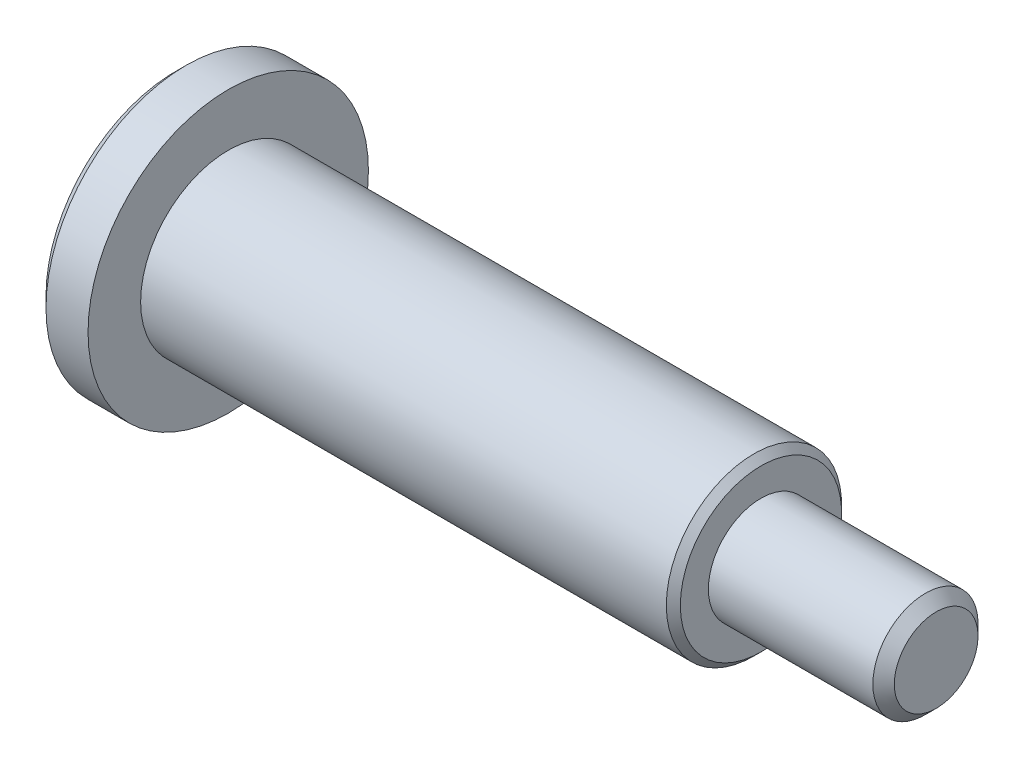
ISO-10303-21;
HEADER;
FILE_DESCRIPTION(('STEP AP214'),'2;1');
FILE_NAME('part.step','',(''),(''),'','','');
FILE_SCHEMA(('AUTOMOTIVE_DESIGN { 1 0 10303 214 1 1 1 1 }'));
ENDSEC;
DATA;
#1=APPLICATION_CONTEXT('core data for automotive mechanical design processes');
#2=APPLICATION_PROTOCOL_DEFINITION('international standard','automotive_design',2000,#1);
#3=PRODUCT_CONTEXT('',#1,'mechanical');
#4=PRODUCT('Part','Part','',(#3));
#5=PRODUCT_RELATED_PRODUCT_CATEGORY('part','',(#4));
#6=PRODUCT_DEFINITION_FORMATION('','',#4);
#7=PRODUCT_DEFINITION_CONTEXT('part definition',#1,'design');
#8=PRODUCT_DEFINITION('design','',#6,#7);
#9=PRODUCT_DEFINITION_SHAPE('','',#8);
#10=(LENGTH_UNIT() NAMED_UNIT(*) SI_UNIT(.MILLI.,.METRE.));
#11=(NAMED_UNIT(*) PLANE_ANGLE_UNIT() SI_UNIT($,.RADIAN.));
#12=(NAMED_UNIT(*) SI_UNIT($,.STERADIAN.) SOLID_ANGLE_UNIT());
#13=UNCERTAINTY_MEASURE_WITH_UNIT(LENGTH_MEASURE(1.E-05),#10,'distance_accuracy_value','');
#14=(GEOMETRIC_REPRESENTATION_CONTEXT(3) GLOBAL_UNCERTAINTY_ASSIGNED_CONTEXT((#13)) GLOBAL_UNIT_ASSIGNED_CONTEXT((#10,
#11,#12)) REPRESENTATION_CONTEXT('',''));
#15=CARTESIAN_POINT('',(0.,0.,0.));
#16=DIRECTION('',(0.,0.,1.));
#17=DIRECTION('',(1.,0.,0.));
#18=AXIS2_PLACEMENT_3D('',#15,#16,#17);
#19=CARTESIAN_POINT('',(0.,0.,0.));
#20=DIRECTION('',(-1.,0.,0.));
#21=DIRECTION('',(0.,0.,1.));
#22=AXIS2_PLACEMENT_3D('',#19,#20,#21);
#23=CONICAL_SURFACE('',#22,0.749999999982265,1.04719755120245);
#24=CARTESIAN_POINT('',(0.433012701876123,0.,0.));
#25=VERTEX_POINT('',#24);
#26=VERTEX_LOOP('',#25);
#27=FACE_BOUND('',#26,.T.);
#28=CARTESIAN_POINT('',(0.,0.,0.));
#29=DIRECTION('',(-1.,0.,0.));
#30=DIRECTION('',(0.,0.,1.));
#31=AXIS2_PLACEMENT_3D('',#28,#29,#30);
#32=CIRCLE('',#31,0.749999999982265);
#33=CARTESIAN_POINT('',(0.,0.649519052830649,-0.374999999995566));
#34=VERTEX_POINT('',#33);
#35=CARTESIAN_POINT('',(0.,0.,-0.749999999991132));
#36=VERTEX_POINT('',#35);
#37=EDGE_CURVE('E130',#34,#36,#32,.T.);
#38=ORIENTED_EDGE('',*,*,#37,.T.);
#39=CARTESIAN_POINT('',(0.,0.,0.));
#40=DIRECTION('',(-1.,0.,0.));
#41=DIRECTION('',(0.,0.,1.));
#42=AXIS2_PLACEMENT_3D('',#39,#40,#41);
#43=CIRCLE('',#42,0.749999999982265);
#44=CARTESIAN_POINT('',(0.,-0.649519052830649,-0.374999999995567));
#45=VERTEX_POINT('',#44);
#46=EDGE_CURVE('E178',#36,#45,#43,.T.);
#47=ORIENTED_EDGE('',*,*,#46,.T.);
#48=CARTESIAN_POINT('',(0.,0.,0.));
#49=DIRECTION('',(-1.,0.,0.));
#50=DIRECTION('',(0.,0.,1.));
#51=AXIS2_PLACEMENT_3D('',#48,#49,#50);
#52=CIRCLE('',#51,0.749999999982265);
#53=CARTESIAN_POINT('',(0.,-0.649519052830649,0.374999999995566));
#54=VERTEX_POINT('',#53);
#55=EDGE_CURVE('E161',#45,#54,#52,.T.);
#56=ORIENTED_EDGE('',*,*,#55,.T.);
#57=CARTESIAN_POINT('',(0.,0.,0.));
#58=DIRECTION('',(-1.,0.,0.));
#59=DIRECTION('',(0.,0.,1.));
#60=AXIS2_PLACEMENT_3D('',#57,#58,#59);
#61=CIRCLE('',#60,0.749999999982265);
#62=CARTESIAN_POINT('',(0.,0.,0.749999999991132));
#63=VERTEX_POINT('',#62);
#64=EDGE_CURVE('E111',#54,#63,#61,.T.);
#65=ORIENTED_EDGE('',*,*,#64,.T.);
#66=CARTESIAN_POINT('',(0.,0.,0.));
#67=DIRECTION('',(-1.,0.,0.));
#68=DIRECTION('',(0.,0.,1.));
#69=AXIS2_PLACEMENT_3D('',#66,#67,#68);
#70=CIRCLE('',#69,0.749999999982265);
#71=CARTESIAN_POINT('',(0.,0.64951905283065,0.374999999995566));
#72=VERTEX_POINT('',#71);
#73=EDGE_CURVE('E113',#63,#72,#70,.T.);
#74=ORIENTED_EDGE('',*,*,#73,.T.);
#75=CARTESIAN_POINT('',(0.,0.,0.));
#76=DIRECTION('',(-1.,0.,0.));
#77=DIRECTION('',(0.,0.,1.));
#78=AXIS2_PLACEMENT_3D('',#75,#76,#77);
#79=CIRCLE('',#78,0.749999999982265);
#80=EDGE_CURVE('E115',#72,#34,#79,.T.);
#81=ORIENTED_EDGE('',*,*,#80,.T.);
#82=EDGE_LOOP('',(#38,#47,#56,#65,#74,#81));
#83=FACE_BOUND('',#82,.T.);
#84=ADVANCED_FACE('F39',(#27,#83),#23,.F.);
#85=CARTESIAN_POINT('',(0.,0.,0.));
#86=DIRECTION('',(1.,0.,0.));
#87=DIRECTION('',(0.,0.,-1.));
#88=AXIS2_PLACEMENT_3D('',#85,#86,#87);
#89=PLANE('',#88);
#90=DIRECTION('',(0.,1.,0.));
#91=VECTOR('',#90,1.);
#92=CARTESIAN_POINT('',(0.,0.433012701892219,0.75));
#93=LINE('',#92,#91);
#94=CARTESIAN_POINT('',(0.,0.43301270189222,0.75));
#95=VERTEX_POINT('',#94);
#96=EDGE_CURVE('E136',#95,#63,#93,.F.);
#97=ORIENTED_EDGE('',*,*,#96,.F.);
#98=DIRECTION('',(0.,0.5,-0.866025403784439));
#99=VECTOR('',#98,1.);
#100=CARTESIAN_POINT('',(0.,0.866025403784439,0.));
#101=LINE('',#100,#99);
#102=EDGE_CURVE('E133',#72,#95,#101,.F.);
#103=ORIENTED_EDGE('',*,*,#102,.F.);
#104=ORIENTED_EDGE('',*,*,#73,.F.);
#105=EDGE_LOOP('',(#97,#103,#104));
#106=FACE_BOUND('',#105,.T.);
#107=ADVANCED_FACE('F134',(#106),#89,.F.);
#108=CARTESIAN_POINT('',(0.,0.,0.));
#109=DIRECTION('',(1.,0.,0.));
#110=DIRECTION('',(0.,0.,-1.));
#111=AXIS2_PLACEMENT_3D('',#108,#109,#110);
#112=PLANE('',#111);
#113=ORIENTED_EDGE('',*,*,#80,.F.);
#114=DIRECTION('',(0.,0.5,-0.866025403784439));
#115=VECTOR('',#114,1.);
#116=CARTESIAN_POINT('',(0.,0.866025403784439,0.));
#117=LINE('',#116,#115);
#118=CARTESIAN_POINT('',(0.,0.866025403784439,0.));
#119=VERTEX_POINT('',#118);
#120=EDGE_CURVE('E125',#119,#72,#117,.F.);
#121=ORIENTED_EDGE('',*,*,#120,.F.);
#122=DIRECTION('',(0.,-0.5,-0.866025403784439));
#123=VECTOR('',#122,1.);
#124=CARTESIAN_POINT('',(0.,0.433012701892219,-0.75));
#125=LINE('',#124,#123);
#126=EDGE_CURVE('E128',#34,#119,#125,.F.);
#127=ORIENTED_EDGE('',*,*,#126,.F.);
#128=EDGE_LOOP('',(#113,#121,#127));
#129=FACE_BOUND('',#128,.T.);
#130=ADVANCED_FACE('F123',(#129),#112,.F.);
#131=CARTESIAN_POINT('',(0.,0.,0.));
#132=DIRECTION('',(1.,0.,0.));
#133=DIRECTION('',(0.,0.,-1.));
#134=AXIS2_PLACEMENT_3D('',#131,#132,#133);
#135=PLANE('',#134);
#136=DIRECTION('',(0.,-0.5,-0.866025403784439));
#137=VECTOR('',#136,1.);
#138=CARTESIAN_POINT('',(0.,0.433012701892219,-0.75));
#139=LINE('',#138,#137);
#140=CARTESIAN_POINT('',(0.,0.433012701892219,-0.75));
#141=VERTEX_POINT('',#140);
#142=EDGE_CURVE('E157',#141,#34,#139,.F.);
#143=ORIENTED_EDGE('',*,*,#142,.F.);
#144=DIRECTION('',(0.,1.,0.));
#145=VECTOR('',#144,1.);
#146=CARTESIAN_POINT('',(0.,-0.433012701892219,-0.75));
#147=LINE('',#146,#145);
#148=EDGE_CURVE('E434',#36,#141,#147,.T.);
#149=ORIENTED_EDGE('',*,*,#148,.F.);
#150=ORIENTED_EDGE('',*,*,#37,.F.);
#151=EDGE_LOOP('',(#143,#149,#150));
#152=FACE_BOUND('',#151,.T.);
#153=ADVANCED_FACE('F265',(#152),#135,.F.);
#154=CARTESIAN_POINT('',(0.,0.,0.));
#155=DIRECTION('',(1.,0.,0.));
#156=DIRECTION('',(0.,0.,-1.));
#157=AXIS2_PLACEMENT_3D('',#154,#155,#156);
#158=PLANE('',#157);
#159=DIRECTION('',(0.,1.,0.));
#160=VECTOR('',#159,1.);
#161=CARTESIAN_POINT('',(0.,-0.433012701892219,-0.75));
#162=LINE('',#161,#160);
#163=CARTESIAN_POINT('',(0.,-0.43301270189222,-0.75));
#164=VERTEX_POINT('',#163);
#165=EDGE_CURVE('E445',#164,#36,#162,.T.);
#166=ORIENTED_EDGE('',*,*,#165,.F.);
#167=DIRECTION('',(0.,-0.5,0.866025403784439));
#168=VECTOR('',#167,1.);
#169=CARTESIAN_POINT('',(0.,-0.866025403784439,0.));
#170=LINE('',#169,#168);
#171=EDGE_CURVE('E485',#45,#164,#170,.F.);
#172=ORIENTED_EDGE('',*,*,#171,.F.);
#173=ORIENTED_EDGE('',*,*,#46,.F.);
#174=EDGE_LOOP('',(#166,#172,#173));
#175=FACE_BOUND('',#174,.T.);
#176=ADVANCED_FACE('F261',(#175),#158,.F.);
#177=CARTESIAN_POINT('',(0.,0.,0.));
#178=DIRECTION('',(1.,0.,0.));
#179=DIRECTION('',(0.,0.,-1.));
#180=AXIS2_PLACEMENT_3D('',#177,#178,#179);
#181=PLANE('',#180);
#182=DIRECTION('',(0.,0.5,0.866025403784439));
#183=VECTOR('',#182,1.);
#184=CARTESIAN_POINT('',(0.,-0.433012701892219,0.75));
#185=LINE('',#184,#183);
#186=CARTESIAN_POINT('',(0.,-0.433012701892219,0.75));
#187=VERTEX_POINT('',#186);
#188=EDGE_CURVE('E469',#187,#54,#185,.F.);
#189=ORIENTED_EDGE('',*,*,#188,.F.);
#190=DIRECTION('',(0.,1.,0.));
#191=VECTOR('',#190,1.);
#192=CARTESIAN_POINT('',(0.,0.433012701892219,0.75));
#193=LINE('',#192,#191);
#194=EDGE_CURVE('E145',#63,#187,#193,.F.);
#195=ORIENTED_EDGE('',*,*,#194,.F.);
#196=ORIENTED_EDGE('',*,*,#64,.F.);
#197=EDGE_LOOP('',(#189,#195,#196));
#198=FACE_BOUND('',#197,.T.);
#199=ADVANCED_FACE('F257',(#198),#181,.F.);
#200=CARTESIAN_POINT('',(0.,0.,0.));
#201=DIRECTION('',(1.,0.,0.));
#202=DIRECTION('',(0.,0.,-1.));
#203=AXIS2_PLACEMENT_3D('',#200,#201,#202);
#204=PLANE('',#203);
#205=DIRECTION('',(0.,-0.5,0.866025403784439));
#206=VECTOR('',#205,1.);
#207=CARTESIAN_POINT('',(0.,-0.866025403784439,0.));
#208=LINE('',#207,#206);
#209=CARTESIAN_POINT('',(0.,-0.866025403784439,0.));
#210=VERTEX_POINT('',#209);
#211=EDGE_CURVE('E442',#210,#45,#208,.F.);
#212=ORIENTED_EDGE('',*,*,#211,.F.);
#213=DIRECTION('',(0.,0.5,0.866025403784439));
#214=VECTOR('',#213,1.);
#215=CARTESIAN_POINT('',(0.,-0.433012701892219,0.75));
#216=LINE('',#215,#214);
#217=EDGE_CURVE('E472',#54,#210,#216,.F.);
#218=ORIENTED_EDGE('',*,*,#217,.F.);
#219=ORIENTED_EDGE('',*,*,#55,.F.);
#220=EDGE_LOOP('',(#212,#218,#219));
#221=FACE_BOUND('',#220,.T.);
#222=ADVANCED_FACE('F254',(#221),#204,.F.);
#223=CARTESIAN_POINT('',(20.2,1.1935,0.));
#224=DIRECTION('',(-1.,0.,0.));
#225=DIRECTION('',(0.,0.,1.));
#226=AXIS2_PLACEMENT_3D('',#223,#224,#225);
#227=PLANE('',#226);
#228=CARTESIAN_POINT('',(20.2000000000382,0.,0.));
#229=DIRECTION('',(-1.,0.,0.));
#230=DIRECTION('',(0.,0.,1.));
#231=AXIS2_PLACEMENT_3D('',#228,#229,#230);
#232=CIRCLE('',#231,1.19350000005625);
#233=CARTESIAN_POINT('',(20.2000000000382,0.,1.19350000005625));
#234=VERTEX_POINT('',#233);
#235=EDGE_CURVE('E186',#234,#234,#232,.T.);
#236=ORIENTED_EDGE('',*,*,#235,.F.);
#237=EDGE_LOOP('',(#236));
#238=FACE_BOUND('',#237,.T.);
#239=ADVANCED_FACE('F252',(#238),#227,.F.);
#240=CARTESIAN_POINT('',(0.,0.433012701892219,0.75));
#241=DIRECTION('',(0.,0.,-1.));
#242=DIRECTION('',(-1.,0.,0.));
#243=AXIS2_PLACEMENT_3D('',#240,#241,#242);
#244=PLANE('',#243);
#245=ORIENTED_EDGE('',*,*,#194,.T.);
#246=DIRECTION('',(1.,0.,0.));
#247=VECTOR('',#246,1.);
#248=CARTESIAN_POINT('',(0.,-0.433012701892219,0.75));
#249=LINE('',#248,#247);
#250=CARTESIAN_POINT('',(-1.5,-0.433012701892219,0.75));
#251=VERTEX_POINT('',#250);
#252=EDGE_CURVE('E473',#251,#187,#249,.T.);
#253=ORIENTED_EDGE('',*,*,#252,.F.);
#254=DIRECTION('',(0.,1.,0.));
#255=VECTOR('',#254,1.);
#256=CARTESIAN_POINT('',(-1.5,0.,0.75));
#257=LINE('',#256,#255);
#258=CARTESIAN_POINT('',(-1.5,0.433012701892219,0.75));
#259=VERTEX_POINT('',#258);
#260=EDGE_CURVE('E189',#251,#259,#257,.T.);
#261=ORIENTED_EDGE('',*,*,#260,.T.);
#262=DIRECTION('',(1.,0.,0.));
#263=VECTOR('',#262,1.);
#264=CARTESIAN_POINT('',(0.,0.43301270189222,0.75));
#265=LINE('',#264,#263);
#266=EDGE_CURVE('E140',#95,#259,#265,.F.);
#267=ORIENTED_EDGE('',*,*,#266,.F.);
#268=ORIENTED_EDGE('',*,*,#96,.T.);
#269=EDGE_LOOP('',(#245,#253,#261,#267,#268));
#270=FACE_BOUND('',#269,.T.);
#271=ADVANCED_FACE('F249',(#270),#244,.T.);
#272=CARTESIAN_POINT('',(0.,0.866025403784439,0.));
#273=DIRECTION('',(0.,-0.866025403784439,-0.5));
#274=DIRECTION('',(0.,0.5,-0.866025403784439));
#275=AXIS2_PLACEMENT_3D('',#272,#273,#274);
#276=PLANE('',#275);
#277=ORIENTED_EDGE('',*,*,#102,.T.);
#278=ORIENTED_EDGE('',*,*,#266,.T.);
#279=DIRECTION('',(0.,0.500000000000001,-0.866025403784438));
#280=VECTOR('',#279,1.);
#281=CARTESIAN_POINT('',(-1.5,0.433012701892219,0.75));
#282=LINE('',#281,#280);
#283=CARTESIAN_POINT('',(-1.5,0.866025403784439,0.));
#284=VERTEX_POINT('',#283);
#285=EDGE_CURVE('E462',#259,#284,#282,.T.);
#286=ORIENTED_EDGE('',*,*,#285,.T.);
#287=DIRECTION('',(1.,0.,0.));
#288=VECTOR('',#287,1.);
#289=CARTESIAN_POINT('',(0.,0.866025403784438,0.));
#290=LINE('',#289,#288);
#291=EDGE_CURVE('E144',#119,#284,#290,.F.);
#292=ORIENTED_EDGE('',*,*,#291,.F.);
#293=ORIENTED_EDGE('',*,*,#120,.T.);
#294=EDGE_LOOP('',(#277,#278,#286,#292,#293));
#295=FACE_BOUND('',#294,.T.);
#296=ADVANCED_FACE('F142',(#295),#276,.T.);
#297=CARTESIAN_POINT('',(0.,0.433012701892219,-0.75));
#298=DIRECTION('',(0.,-0.866025403784439,0.5));
#299=DIRECTION('',(0.,-0.5,-0.866025403784439));
#300=AXIS2_PLACEMENT_3D('',#297,#298,#299);
#301=PLANE('',#300);
#302=ORIENTED_EDGE('',*,*,#126,.T.);
#303=ORIENTED_EDGE('',*,*,#291,.T.);
#304=DIRECTION('',(0.,-0.500000000000001,-0.866025403784438));
#305=VECTOR('',#304,1.);
#306=CARTESIAN_POINT('',(-1.5,0.866025403784439,0.));
#307=LINE('',#306,#305);
#308=CARTESIAN_POINT('',(-1.5,0.433012701892219,-0.75));
#309=VERTEX_POINT('',#308);
#310=EDGE_CURVE('E440',#284,#309,#307,.T.);
#311=ORIENTED_EDGE('',*,*,#310,.T.);
#312=DIRECTION('',(1.,0.,0.));
#313=VECTOR('',#312,1.);
#314=CARTESIAN_POINT('',(0.,0.433012701892219,-0.75));
#315=LINE('',#314,#313);
#316=EDGE_CURVE('E438',#141,#309,#315,.F.);
#317=ORIENTED_EDGE('',*,*,#316,.F.);
#318=ORIENTED_EDGE('',*,*,#142,.T.);
#319=EDGE_LOOP('',(#302,#303,#311,#317,#318));
#320=FACE_BOUND('',#319,.T.);
#321=ADVANCED_FACE('F242',(#320),#301,.T.);
#322=CARTESIAN_POINT('',(0.,-0.433012701892219,-0.75));
#323=DIRECTION('',(0.,0.,1.));
#324=DIRECTION('',(1.,0.,0.));
#325=AXIS2_PLACEMENT_3D('',#322,#323,#324);
#326=PLANE('',#325);
#327=ORIENTED_EDGE('',*,*,#148,.T.);
#328=ORIENTED_EDGE('',*,*,#316,.T.);
#329=DIRECTION('',(0.,1.,0.));
#330=VECTOR('',#329,1.);
#331=CARTESIAN_POINT('',(-1.5,0.,-0.75));
#332=LINE('',#331,#330);
#333=CARTESIAN_POINT('',(-1.5,-0.433012701892219,-0.75));
#334=VERTEX_POINT('',#333);
#335=EDGE_CURVE('E463',#309,#334,#332,.F.);
#336=ORIENTED_EDGE('',*,*,#335,.T.);
#337=DIRECTION('',(1.,0.,0.));
#338=VECTOR('',#337,1.);
#339=CARTESIAN_POINT('',(0.,-0.43301270189222,-0.75));
#340=LINE('',#339,#338);
#341=EDGE_CURVE('E490',#164,#334,#340,.F.);
#342=ORIENTED_EDGE('',*,*,#341,.F.);
#343=ORIENTED_EDGE('',*,*,#165,.T.);
#344=EDGE_LOOP('',(#327,#328,#336,#342,#343));
#345=FACE_BOUND('',#344,.T.);
#346=ADVANCED_FACE('F239',(#345),#326,.T.);
#347=CARTESIAN_POINT('',(0.,-0.866025403784439,0.));
#348=DIRECTION('',(0.,0.866025403784439,0.5));
#349=DIRECTION('',(0.,-0.5,0.866025403784439));
#350=AXIS2_PLACEMENT_3D('',#347,#348,#349);
#351=PLANE('',#350);
#352=ORIENTED_EDGE('',*,*,#171,.T.);
#353=ORIENTED_EDGE('',*,*,#341,.T.);
#354=DIRECTION('',(0.,-0.500000000000001,0.866025403784438));
#355=VECTOR('',#354,1.);
#356=CARTESIAN_POINT('',(-1.5,-0.433012701892219,-0.75));
#357=LINE('',#356,#355);
#358=CARTESIAN_POINT('',(-1.5,-0.866025403784439,0.));
#359=VERTEX_POINT('',#358);
#360=EDGE_CURVE('E57',#334,#359,#357,.T.);
#361=ORIENTED_EDGE('',*,*,#360,.T.);
#362=DIRECTION('',(1.,0.,0.));
#363=VECTOR('',#362,1.);
#364=CARTESIAN_POINT('',(0.,-0.866025403784438,0.));
#365=LINE('',#364,#363);
#366=EDGE_CURVE('E190',#210,#359,#365,.F.);
#367=ORIENTED_EDGE('',*,*,#366,.F.);
#368=ORIENTED_EDGE('',*,*,#211,.T.);
#369=EDGE_LOOP('',(#352,#353,#361,#367,#368));
#370=FACE_BOUND('',#369,.T.);
#371=ADVANCED_FACE('F235',(#370),#351,.T.);
#372=CARTESIAN_POINT('',(0.,-0.433012701892219,0.75));
#373=DIRECTION('',(0.,0.866025403784439,-0.5));
#374=DIRECTION('',(0.,0.5,0.866025403784439));
#375=AXIS2_PLACEMENT_3D('',#372,#373,#374);
#376=PLANE('',#375);
#377=ORIENTED_EDGE('',*,*,#217,.T.);
#378=ORIENTED_EDGE('',*,*,#366,.T.);
#379=DIRECTION('',(0.,0.500000000000001,0.866025403784438));
#380=VECTOR('',#379,1.);
#381=CARTESIAN_POINT('',(-1.5,-0.866025403784439,0.));
#382=LINE('',#381,#380);
#383=EDGE_CURVE('E194',#359,#251,#382,.T.);
#384=ORIENTED_EDGE('',*,*,#383,.T.);
#385=ORIENTED_EDGE('',*,*,#252,.T.);
#386=ORIENTED_EDGE('',*,*,#188,.T.);
#387=EDGE_LOOP('',(#377,#378,#384,#385,#386));
#388=FACE_BOUND('',#387,.T.);
#389=ADVANCED_FACE('F232',(#388),#376,.T.);
#390=CARTESIAN_POINT('',(19.8934999999594,0.,0.));
#391=DIRECTION('',(-1.,0.,0.));
#392=DIRECTION('',(0.,0.,1.));
#393=AXIS2_PLACEMENT_3D('',#390,#391,#392);
#394=CONICAL_SURFACE('',#393,1.50000000013506,0.785398163397448);
#395=CARTESIAN_POINT('',(19.8935,0.,0.));
#396=DIRECTION('',(-1.,0.,0.));
#397=DIRECTION('',(0.,0.,1.));
#398=AXIS2_PLACEMENT_3D('',#395,#396,#397);
#399=CIRCLE('',#398,1.5);
#400=CARTESIAN_POINT('',(19.8935,0.,1.5));
#401=VERTEX_POINT('',#400);
#402=EDGE_CURVE('E191',#401,#401,#399,.T.);
#403=ORIENTED_EDGE('',*,*,#402,.F.);
#404=EDGE_LOOP('',(#403));
#405=FACE_BOUND('',#404,.T.);
#406=ORIENTED_EDGE('',*,*,#235,.T.);
#407=EDGE_LOOP('',(#406));
#408=FACE_BOUND('',#407,.T.);
#409=ADVANCED_FACE('F230',(#405,#408),#394,.T.);
#410=CARTESIAN_POINT('',(-1.5,0.,0.));
#411=DIRECTION('',(1.,0.,0.));
#412=DIRECTION('',(0.,0.,-1.));
#413=AXIS2_PLACEMENT_3D('',#410,#411,#412);
#414=PLANE('',#413);
#415=CARTESIAN_POINT('',(-1.5,0.,0.));
#416=DIRECTION('',(1.,0.,0.));
#417=DIRECTION('',(0.,0.,-1.));
#418=AXIS2_PLACEMENT_3D('',#415,#416,#417);
#419=CIRCLE('',#418,3.7);
#420=CARTESIAN_POINT('',(-1.5,0.,-3.7));
#421=VERTEX_POINT('',#420);
#422=EDGE_CURVE('E183',#421,#421,#419,.F.);
#423=ORIENTED_EDGE('',*,*,#422,.T.);
#424=EDGE_LOOP('',(#423));
#425=FACE_BOUND('',#424,.T.);
#426=ORIENTED_EDGE('',*,*,#360,.F.);
#427=ORIENTED_EDGE('',*,*,#335,.F.);
#428=ORIENTED_EDGE('',*,*,#310,.F.);
#429=ORIENTED_EDGE('',*,*,#285,.F.);
#430=ORIENTED_EDGE('',*,*,#260,.F.);
#431=ORIENTED_EDGE('',*,*,#383,.F.);
#432=EDGE_LOOP('',(#426,#427,#428,#429,#430,#431));
#433=FACE_BOUND('',#432,.T.);
#434=ADVANCED_FACE('F227',(#425,#433),#414,.F.);
#435=CARTESIAN_POINT('',(18.2,0.,0.));
#436=DIRECTION('',(-1.,0.,0.));
#437=DIRECTION('',(0.,0.,1.));
#438=AXIS2_PLACEMENT_3D('',#435,#436,#437);
#439=CYLINDRICAL_SURFACE('',#438,1.5);
#440=CARTESIAN_POINT('',(15.2,0.,0.));
#441=DIRECTION('',(-1.,0.,0.));
#442=DIRECTION('',(0.,0.,1.));
#443=AXIS2_PLACEMENT_3D('',#440,#441,#442);
#444=CIRCLE('',#443,1.5);
#445=CARTESIAN_POINT('',(15.2,0.,1.5));
#446=VERTEX_POINT('',#445);
#447=EDGE_CURVE('E173',#446,#446,#444,.F.);
#448=ORIENTED_EDGE('',*,*,#447,.T.);
#449=EDGE_LOOP('',(#448));
#450=FACE_BOUND('',#449,.T.);
#451=ORIENTED_EDGE('',*,*,#402,.T.);
#452=EDGE_LOOP('',(#451));
#453=FACE_BOUND('',#452,.T.);
#454=ADVANCED_FACE('F225',(#450,#453),#439,.T.);
#455=CARTESIAN_POINT('',(5.,0.,0.));
#456=DIRECTION('',(-1.,0.,0.));
#457=DIRECTION('',(0.,0.,1.));
#458=AXIS2_PLACEMENT_3D('',#455,#456,#457);
#459=CYLINDRICAL_SURFACE('',#458,4.);
#460=CARTESIAN_POINT('',(-1.2,0.,0.));
#461=DIRECTION('',(1.,0.,0.));
#462=DIRECTION('',(0.,0.,-1.));
#463=AXIS2_PLACEMENT_3D('',#460,#461,#462);
#464=CIRCLE('',#463,4.);
#465=CARTESIAN_POINT('',(-1.2,0.,-4.));
#466=VERTEX_POINT('',#465);
#467=EDGE_CURVE('E167',#466,#466,#464,.T.);
#468=ORIENTED_EDGE('',*,*,#467,.T.);
#469=EDGE_LOOP('',(#468));
#470=FACE_BOUND('',#469,.T.);
#471=CARTESIAN_POINT('',(0.,0.,0.));
#472=DIRECTION('',(-1.,0.,0.));
#473=DIRECTION('',(0.,0.,1.));
#474=AXIS2_PLACEMENT_3D('',#471,#472,#473);
#475=CIRCLE('',#474,4.);
#476=CARTESIAN_POINT('',(0.,0.,4.));
#477=VERTEX_POINT('',#476);
#478=EDGE_CURVE('E168',#477,#477,#475,.T.);
#479=ORIENTED_EDGE('',*,*,#478,.T.);
#480=EDGE_LOOP('',(#479));
#481=FACE_BOUND('',#480,.T.);
#482=ADVANCED_FACE('F222',(#470,#481),#459,.T.);
#483=CARTESIAN_POINT('',(15.2,2.5,0.));
#484=DIRECTION('',(-1.,0.,0.));
#485=DIRECTION('',(0.,0.,1.));
#486=AXIS2_PLACEMENT_3D('',#483,#484,#485);
#487=PLANE('',#486);
#488=CARTESIAN_POINT('',(15.2,0.,0.));
#489=DIRECTION('',(-1.,0.,0.));
#490=DIRECTION('',(0.,0.,1.));
#491=AXIS2_PLACEMENT_3D('',#488,#489,#490);
#492=CIRCLE('',#491,2.3);
#493=CARTESIAN_POINT('',(15.2,0.,2.3));
#494=VERTEX_POINT('',#493);
#495=EDGE_CURVE('E12',#494,#494,#492,.F.);
#496=ORIENTED_EDGE('',*,*,#495,.T.);
#497=EDGE_LOOP('',(#496));
#498=FACE_BOUND('',#497,.T.);
#499=ORIENTED_EDGE('',*,*,#447,.F.);
#500=EDGE_LOOP('',(#499));
#501=FACE_BOUND('',#500,.T.);
#502=ADVANCED_FACE('F218',(#498,#501),#487,.F.);
#503=CARTESIAN_POINT('',(0.,4.,0.));
#504=DIRECTION('',(-1.,0.,0.));
#505=DIRECTION('',(0.,0.,1.));
#506=AXIS2_PLACEMENT_3D('',#503,#504,#505);
#507=PLANE('',#506);
#508=ORIENTED_EDGE('',*,*,#478,.F.);
#509=EDGE_LOOP('',(#508));
#510=FACE_BOUND('',#509,.T.);
#511=CARTESIAN_POINT('',(0.,0.,0.));
#512=DIRECTION('',(-1.,0.,0.));
#513=DIRECTION('',(0.,0.,1.));
#514=AXIS2_PLACEMENT_3D('',#511,#512,#513);
#515=CIRCLE('',#514,2.5);
#516=CARTESIAN_POINT('',(0.,0.,2.5));
#517=VERTEX_POINT('',#516);
#518=EDGE_CURVE('E164',#517,#517,#515,.F.);
#519=ORIENTED_EDGE('',*,*,#518,.F.);
#520=EDGE_LOOP('',(#519));
#521=FACE_BOUND('',#520,.T.);
#522=ADVANCED_FACE('F212',(#510,#521),#507,.F.);
#523=CARTESIAN_POINT('',(5.,0.,0.));
#524=DIRECTION('',(-1.,0.,0.));
#525=DIRECTION('',(0.,0.,1.));
#526=AXIS2_PLACEMENT_3D('',#523,#524,#525);
#527=CYLINDRICAL_SURFACE('',#526,2.5);
#528=CARTESIAN_POINT('',(15.,0.,0.));
#529=DIRECTION('',(-1.,0.,0.));
#530=DIRECTION('',(0.,0.,1.));
#531=AXIS2_PLACEMENT_3D('',#528,#529,#530);
#532=CIRCLE('',#531,2.5);
#533=CARTESIAN_POINT('',(15.,0.,2.5));
#534=VERTEX_POINT('',#533);
#535=EDGE_CURVE('E49',#534,#534,#532,.T.);
#536=ORIENTED_EDGE('',*,*,#535,.T.);
#537=EDGE_LOOP('',(#536));
#538=FACE_BOUND('',#537,.T.);
#539=ORIENTED_EDGE('',*,*,#518,.T.);
#540=EDGE_LOOP('',(#539));
#541=FACE_BOUND('',#540,.T.);
#542=ADVANCED_FACE('F199',(#538,#541),#527,.T.);
#543=CARTESIAN_POINT('',(-1.2,0.,0.));
#544=DIRECTION('',(1.,0.,0.));
#545=DIRECTION('',(0.,0.,-1.));
#546=AXIS2_PLACEMENT_3D('',#543,#544,#545);
#547=CONICAL_SURFACE('',#546,4.,0.785398163397448);
#548=ORIENTED_EDGE('',*,*,#422,.F.);
#549=EDGE_LOOP('',(#548));
#550=FACE_BOUND('',#549,.T.);
#551=ORIENTED_EDGE('',*,*,#467,.F.);
#552=EDGE_LOOP('',(#551));
#553=FACE_BOUND('',#552,.T.);
#554=ADVANCED_FACE('F203',(#550,#553),#547,.T.);
#555=CARTESIAN_POINT('',(15.,0.,0.));
#556=DIRECTION('',(-1.,0.,0.));
#557=DIRECTION('',(0.,0.,1.));
#558=AXIS2_PLACEMENT_3D('',#555,#556,#557);
#559=CONICAL_SURFACE('',#558,2.5,0.785398163397443);
#560=ORIENTED_EDGE('',*,*,#495,.F.);
#561=EDGE_LOOP('',(#560));
#562=FACE_BOUND('',#561,.T.);
#563=ORIENTED_EDGE('',*,*,#535,.F.);
#564=EDGE_LOOP('',(#563));
#565=FACE_BOUND('',#564,.T.);
#566=ADVANCED_FACE('F42',(#562,#565),#559,.T.);
#567=CLOSED_SHELL('',(#84,#107,#130,#153,#176,#199,#222,#239,#271,#296,#321,#346,#371,#389,#409,
#434,#454,#482,#502,#522,#542,#554,#566));
#568=MANIFOLD_SOLID_BREP('B2',#567);
#569=ADVANCED_BREP_SHAPE_REPRESENTATION('',(#18,#568),#14);
#570=SHAPE_DEFINITION_REPRESENTATION(#9,#569);
ENDSEC;
END-ISO-10303-21;
